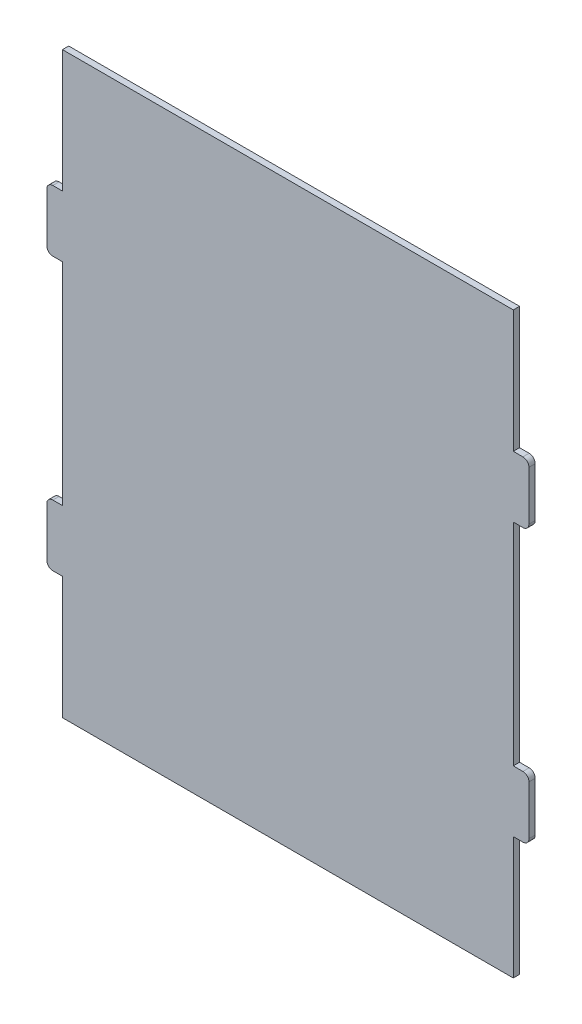
ISO-10303-21;
HEADER;
FILE_DESCRIPTION(('STEP AP214'),'2;1');
FILE_NAME('part.step','',(''),(''),'','','');
FILE_SCHEMA(('AUTOMOTIVE_DESIGN { 1 0 10303 214 1 1 1 1 }'));
ENDSEC;
DATA;
#1=APPLICATION_CONTEXT('core data for automotive mechanical design processes');
#2=APPLICATION_PROTOCOL_DEFINITION('international standard','automotive_design',2000,#1);
#3=PRODUCT_CONTEXT('',#1,'mechanical');
#4=PRODUCT('Part','Part','',(#3));
#5=PRODUCT_RELATED_PRODUCT_CATEGORY('part','',(#4));
#6=PRODUCT_DEFINITION_FORMATION('','',#4);
#7=PRODUCT_DEFINITION_CONTEXT('part definition',#1,'design');
#8=PRODUCT_DEFINITION('design','',#6,#7);
#9=PRODUCT_DEFINITION_SHAPE('','',#8);
#10=(LENGTH_UNIT() NAMED_UNIT(*) SI_UNIT(.MILLI.,.METRE.));
#11=(NAMED_UNIT(*) PLANE_ANGLE_UNIT() SI_UNIT($,.RADIAN.));
#12=(NAMED_UNIT(*) SI_UNIT($,.STERADIAN.) SOLID_ANGLE_UNIT());
#13=UNCERTAINTY_MEASURE_WITH_UNIT(LENGTH_MEASURE(1.E-05),#10,'distance_accuracy_value','');
#14=(GEOMETRIC_REPRESENTATION_CONTEXT(3) GLOBAL_UNCERTAINTY_ASSIGNED_CONTEXT((#13)) GLOBAL_UNIT_ASSIGNED_CONTEXT((#10,
#11,#12)) REPRESENTATION_CONTEXT('',''));
#15=CARTESIAN_POINT('',(0.,0.,0.));
#16=DIRECTION('',(0.,0.,1.));
#17=DIRECTION('',(1.,0.,0.));
#18=AXIS2_PLACEMENT_3D('',#15,#16,#17);
#19=CARTESIAN_POINT('',(-97.5,-46.3,2.6));
#20=DIRECTION('',(0.,0.,-1.));
#21=DIRECTION('',(-1.,0.,0.));
#22=AXIS2_PLACEMENT_3D('',#19,#20,#21);
#23=CYLINDRICAL_SURFACE('',#22,2.5);
#24=CARTESIAN_POINT('',(-97.5,-46.3,0.));
#25=DIRECTION('',(0.,0.,1.));
#26=DIRECTION('',(1.,0.,0.));
#27=AXIS2_PLACEMENT_3D('',#24,#25,#26);
#28=CIRCLE('',#27,2.5);
#29=CARTESIAN_POINT('',(-97.5,-43.8,0.));
#30=VERTEX_POINT('',#29);
#31=CARTESIAN_POINT('',(-100.,-46.3,0.));
#32=VERTEX_POINT('',#31);
#33=EDGE_CURVE('E249',#30,#32,#28,.T.);
#34=ORIENTED_EDGE('',*,*,#33,.T.);
#35=DIRECTION('',(0.,0.,-1.));
#36=VECTOR('',#35,1.);
#37=CARTESIAN_POINT('',(-100.,-46.3,2.6));
#38=LINE('',#37,#36);
#39=CARTESIAN_POINT('',(-100.,-46.3,2.6));
#40=VERTEX_POINT('',#39);
#41=EDGE_CURVE('E11',#40,#32,#38,.T.);
#42=ORIENTED_EDGE('',*,*,#41,.F.);
#43=CARTESIAN_POINT('',(-97.5,-46.3,2.6));
#44=DIRECTION('',(0.,0.,1.));
#45=DIRECTION('',(1.,0.,0.));
#46=AXIS2_PLACEMENT_3D('',#43,#44,#45);
#47=CIRCLE('',#46,2.5);
#48=CARTESIAN_POINT('',(-97.5,-43.8,2.6));
#49=VERTEX_POINT('',#48);
#50=EDGE_CURVE('E303',#49,#40,#47,.T.);
#51=ORIENTED_EDGE('',*,*,#50,.F.);
#52=DIRECTION('',(0.,0.,-1.));
#53=VECTOR('',#52,1.);
#54=CARTESIAN_POINT('',(-97.5,-43.8,2.6));
#55=LINE('',#54,#53);
#56=EDGE_CURVE('E245',#49,#30,#55,.T.);
#57=ORIENTED_EDGE('',*,*,#56,.T.);
#58=EDGE_LOOP('',(#34,#42,#51,#57));
#59=FACE_BOUND('',#58,.T.);
#60=ADVANCED_FACE('F33',(#59),#23,.T.);
#61=CARTESIAN_POINT('',(-100.,-66.7,2.6));
#62=DIRECTION('',(1.,0.,0.));
#63=DIRECTION('',(0.,0.,-1.));
#64=AXIS2_PLACEMENT_3D('',#61,#62,#63);
#65=PLANE('',#64);
#66=DIRECTION('',(0.,-1.,0.));
#67=VECTOR('',#66,1.);
#68=CARTESIAN_POINT('',(-100.,-66.7,0.));
#69=LINE('',#68,#67);
#70=CARTESIAN_POINT('',(-100.,-66.7,0.));
#71=VERTEX_POINT('',#70);
#72=EDGE_CURVE('E252',#32,#71,#69,.T.);
#73=ORIENTED_EDGE('',*,*,#72,.T.);
#74=DIRECTION('',(0.,0.,-1.));
#75=VECTOR('',#74,1.);
#76=CARTESIAN_POINT('',(-100.,-66.7,2.6));
#77=LINE('',#76,#75);
#78=CARTESIAN_POINT('',(-100.,-66.7,2.6));
#79=VERTEX_POINT('',#78);
#80=EDGE_CURVE('E41',#79,#71,#77,.T.);
#81=ORIENTED_EDGE('',*,*,#80,.F.);
#82=DIRECTION('',(0.,-1.,0.));
#83=VECTOR('',#82,1.);
#84=CARTESIAN_POINT('',(-100.,-66.7,2.6));
#85=LINE('',#84,#83);
#86=EDGE_CURVE('E152',#40,#79,#85,.T.);
#87=ORIENTED_EDGE('',*,*,#86,.F.);
#88=ORIENTED_EDGE('',*,*,#41,.T.);
#89=EDGE_LOOP('',(#73,#81,#87,#88));
#90=FACE_BOUND('',#89,.T.);
#91=ADVANCED_FACE('F461',(#90),#65,.F.);
#92=CARTESIAN_POINT('',(-97.5,-66.7,2.6));
#93=DIRECTION('',(0.,0.,-1.));
#94=DIRECTION('',(-1.,0.,0.));
#95=AXIS2_PLACEMENT_3D('',#92,#93,#94);
#96=CYLINDRICAL_SURFACE('',#95,2.50000000000004);
#97=CARTESIAN_POINT('',(-97.5,-66.7,0.));
#98=DIRECTION('',(0.,0.,1.));
#99=DIRECTION('',(1.,0.,0.));
#100=AXIS2_PLACEMENT_3D('',#97,#98,#99);
#101=CIRCLE('',#100,2.50000000000004);
#102=CARTESIAN_POINT('',(-97.5,-69.2,0.));
#103=VERTEX_POINT('',#102);
#104=EDGE_CURVE('E254',#71,#103,#101,.T.);
#105=ORIENTED_EDGE('',*,*,#104,.T.);
#106=DIRECTION('',(0.,0.,-1.));
#107=VECTOR('',#106,1.);
#108=CARTESIAN_POINT('',(-97.5,-69.2,2.6));
#109=LINE('',#108,#107);
#110=CARTESIAN_POINT('',(-97.5,-69.2,2.6));
#111=VERTEX_POINT('',#110);
#112=EDGE_CURVE('E370',#111,#103,#109,.T.);
#113=ORIENTED_EDGE('',*,*,#112,.F.);
#114=CARTESIAN_POINT('',(-97.5,-66.7,2.6));
#115=DIRECTION('',(0.,0.,1.));
#116=DIRECTION('',(1.,0.,0.));
#117=AXIS2_PLACEMENT_3D('',#114,#115,#116);
#118=CIRCLE('',#117,2.50000000000004);
#119=EDGE_CURVE('E378',#79,#111,#118,.T.);
#120=ORIENTED_EDGE('',*,*,#119,.F.);
#121=ORIENTED_EDGE('',*,*,#80,.T.);
#122=EDGE_LOOP('',(#105,#113,#120,#121));
#123=FACE_BOUND('',#122,.T.);
#124=ADVANCED_FACE('F376',(#123),#96,.T.);
#125=CARTESIAN_POINT('',(-93.5,-69.2,2.6));
#126=DIRECTION('',(0.,1.,0.));
#127=DIRECTION('',(0.,0.,1.));
#128=AXIS2_PLACEMENT_3D('',#125,#126,#127);
#129=PLANE('',#128);
#130=DIRECTION('',(1.,0.,0.));
#131=VECTOR('',#130,1.);
#132=CARTESIAN_POINT('',(-93.5,-69.2,0.));
#133=LINE('',#132,#131);
#134=CARTESIAN_POINT('',(-93.5,-69.2,0.));
#135=VERTEX_POINT('',#134);
#136=EDGE_CURVE('E256',#103,#135,#133,.T.);
#137=ORIENTED_EDGE('',*,*,#136,.T.);
#138=DIRECTION('',(0.,0.,-1.));
#139=VECTOR('',#138,1.);
#140=CARTESIAN_POINT('',(-93.5,-69.2,2.6));
#141=LINE('',#140,#139);
#142=CARTESIAN_POINT('',(-93.5,-69.2,2.6));
#143=VERTEX_POINT('',#142);
#144=EDGE_CURVE('E367',#143,#135,#141,.T.);
#145=ORIENTED_EDGE('',*,*,#144,.F.);
#146=DIRECTION('',(1.,0.,0.));
#147=VECTOR('',#146,1.);
#148=CARTESIAN_POINT('',(-93.5,-69.2,2.6));
#149=LINE('',#148,#147);
#150=EDGE_CURVE('E396',#111,#143,#149,.T.);
#151=ORIENTED_EDGE('',*,*,#150,.F.);
#152=ORIENTED_EDGE('',*,*,#112,.T.);
#153=EDGE_LOOP('',(#137,#145,#151,#152));
#154=FACE_BOUND('',#153,.T.);
#155=ADVANCED_FACE('F387',(#154),#129,.F.);
#156=CARTESIAN_POINT('',(-93.5,-69.2,2.6));
#157=DIRECTION('',(1.,0.,0.));
#158=DIRECTION('',(0.,0.,-1.));
#159=AXIS2_PLACEMENT_3D('',#156,#157,#158);
#160=PLANE('',#159);
#161=DIRECTION('',(0.,-1.,0.));
#162=VECTOR('',#161,1.);
#163=CARTESIAN_POINT('',(-93.5,-69.2,0.));
#164=LINE('',#163,#162);
#165=CARTESIAN_POINT('',(-93.5,-120.,0.));
#166=VERTEX_POINT('',#165);
#167=EDGE_CURVE('E258',#135,#166,#164,.T.);
#168=ORIENTED_EDGE('',*,*,#167,.T.);
#169=DIRECTION('',(0.,0.,-1.));
#170=VECTOR('',#169,1.);
#171=CARTESIAN_POINT('',(-93.5,-120.,2.6));
#172=LINE('',#171,#170);
#173=CARTESIAN_POINT('',(-93.5,-120.,2.6));
#174=VERTEX_POINT('',#173);
#175=EDGE_CURVE('E364',#174,#166,#172,.T.);
#176=ORIENTED_EDGE('',*,*,#175,.F.);
#177=DIRECTION('',(0.,-1.,0.));
#178=VECTOR('',#177,1.);
#179=CARTESIAN_POINT('',(-93.5,-69.2,2.6));
#180=LINE('',#179,#178);
#181=EDGE_CURVE('E393',#143,#174,#180,.T.);
#182=ORIENTED_EDGE('',*,*,#181,.F.);
#183=ORIENTED_EDGE('',*,*,#144,.T.);
#184=EDGE_LOOP('',(#168,#176,#182,#183));
#185=FACE_BOUND('',#184,.T.);
#186=ADVANCED_FACE('F391',(#185),#160,.F.);
#187=CARTESIAN_POINT('',(-93.5,-120.,2.6));
#188=DIRECTION('',(0.,1.,0.));
#189=DIRECTION('',(0.,0.,1.));
#190=AXIS2_PLACEMENT_3D('',#187,#188,#189);
#191=PLANE('',#190);
#192=DIRECTION('',(1.,0.,0.));
#193=VECTOR('',#192,1.);
#194=CARTESIAN_POINT('',(-93.5,-120.,0.));
#195=LINE('',#194,#193);
#196=CARTESIAN_POINT('',(93.5,-120.,0.));
#197=VERTEX_POINT('',#196);
#198=EDGE_CURVE('E260',#166,#197,#195,.T.);
#199=ORIENTED_EDGE('',*,*,#198,.T.);
#200=DIRECTION('',(0.,0.,-1.));
#201=VECTOR('',#200,1.);
#202=CARTESIAN_POINT('',(93.5,-120.,2.6));
#203=LINE('',#202,#201);
#204=CARTESIAN_POINT('',(93.5,-120.,2.6));
#205=VERTEX_POINT('',#204);
#206=EDGE_CURVE('E361',#205,#197,#203,.T.);
#207=ORIENTED_EDGE('',*,*,#206,.F.);
#208=DIRECTION('',(1.,0.,0.));
#209=VECTOR('',#208,1.);
#210=CARTESIAN_POINT('',(-93.5,-120.,2.6));
#211=LINE('',#210,#209);
#212=EDGE_CURVE('E395',#174,#205,#211,.T.);
#213=ORIENTED_EDGE('',*,*,#212,.F.);
#214=ORIENTED_EDGE('',*,*,#175,.T.);
#215=EDGE_LOOP('',(#199,#207,#213,#214));
#216=FACE_BOUND('',#215,.T.);
#217=ADVANCED_FACE('F474',(#216),#191,.F.);
#218=CARTESIAN_POINT('',(93.5,-120.,2.6));
#219=DIRECTION('',(-1.,0.,0.));
#220=DIRECTION('',(0.,0.,1.));
#221=AXIS2_PLACEMENT_3D('',#218,#219,#220);
#222=PLANE('',#221);
#223=DIRECTION('',(0.,1.,0.));
#224=VECTOR('',#223,1.);
#225=CARTESIAN_POINT('',(93.5,-120.,0.));
#226=LINE('',#225,#224);
#227=CARTESIAN_POINT('',(93.5,-69.2,0.));
#228=VERTEX_POINT('',#227);
#229=EDGE_CURVE('E262',#197,#228,#226,.T.);
#230=ORIENTED_EDGE('',*,*,#229,.T.);
#231=DIRECTION('',(0.,0.,-1.));
#232=VECTOR('',#231,1.);
#233=CARTESIAN_POINT('',(93.5,-69.2,2.6));
#234=LINE('',#233,#232);
#235=CARTESIAN_POINT('',(93.5,-69.2,2.6));
#236=VERTEX_POINT('',#235);
#237=EDGE_CURVE('E358',#236,#228,#234,.T.);
#238=ORIENTED_EDGE('',*,*,#237,.F.);
#239=DIRECTION('',(0.,1.,0.));
#240=VECTOR('',#239,1.);
#241=CARTESIAN_POINT('',(93.5,-120.,2.6));
#242=LINE('',#241,#240);
#243=EDGE_CURVE('E398',#205,#236,#242,.T.);
#244=ORIENTED_EDGE('',*,*,#243,.F.);
#245=ORIENTED_EDGE('',*,*,#206,.T.);
#246=EDGE_LOOP('',(#230,#238,#244,#245));
#247=FACE_BOUND('',#246,.T.);
#248=ADVANCED_FACE('F477',(#247),#222,.F.);
#249=CARTESIAN_POINT('',(93.5,-69.2,2.6));
#250=DIRECTION('',(0.,1.,0.));
#251=DIRECTION('',(0.,0.,1.));
#252=AXIS2_PLACEMENT_3D('',#249,#250,#251);
#253=PLANE('',#252);
#254=DIRECTION('',(1.,0.,0.));
#255=VECTOR('',#254,1.);
#256=CARTESIAN_POINT('',(93.5,-69.2,0.));
#257=LINE('',#256,#255);
#258=CARTESIAN_POINT('',(97.5,-69.2,0.));
#259=VERTEX_POINT('',#258);
#260=EDGE_CURVE('E264',#228,#259,#257,.T.);
#261=ORIENTED_EDGE('',*,*,#260,.T.);
#262=DIRECTION('',(0.,0.,-1.));
#263=VECTOR('',#262,1.);
#264=CARTESIAN_POINT('',(97.5,-69.2,2.6));
#265=LINE('',#264,#263);
#266=CARTESIAN_POINT('',(97.5,-69.2,2.6));
#267=VERTEX_POINT('',#266);
#268=EDGE_CURVE('E355',#267,#259,#265,.T.);
#269=ORIENTED_EDGE('',*,*,#268,.F.);
#270=DIRECTION('',(1.,0.,0.));
#271=VECTOR('',#270,1.);
#272=CARTESIAN_POINT('',(93.5,-69.2,2.6));
#273=LINE('',#272,#271);
#274=EDGE_CURVE('E404',#236,#267,#273,.T.);
#275=ORIENTED_EDGE('',*,*,#274,.F.);
#276=ORIENTED_EDGE('',*,*,#237,.T.);
#277=EDGE_LOOP('',(#261,#269,#275,#276));
#278=FACE_BOUND('',#277,.T.);
#279=ADVANCED_FACE('F481',(#278),#253,.F.);
#280=CARTESIAN_POINT('',(97.5,-66.7,2.6));
#281=DIRECTION('',(0.,0.,-1.));
#282=DIRECTION('',(-1.,0.,0.));
#283=AXIS2_PLACEMENT_3D('',#280,#281,#282);
#284=CYLINDRICAL_SURFACE('',#283,2.50000000000004);
#285=CARTESIAN_POINT('',(97.5,-66.7,0.));
#286=DIRECTION('',(0.,0.,1.));
#287=DIRECTION('',(1.,0.,0.));
#288=AXIS2_PLACEMENT_3D('',#285,#286,#287);
#289=CIRCLE('',#288,2.50000000000004);
#290=CARTESIAN_POINT('',(100.,-66.7,0.));
#291=VERTEX_POINT('',#290);
#292=EDGE_CURVE('E266',#259,#291,#289,.T.);
#293=ORIENTED_EDGE('',*,*,#292,.T.);
#294=DIRECTION('',(0.,0.,-1.));
#295=VECTOR('',#294,1.);
#296=CARTESIAN_POINT('',(100.,-66.7,2.6));
#297=LINE('',#296,#295);
#298=CARTESIAN_POINT('',(100.,-66.7,2.6));
#299=VERTEX_POINT('',#298);
#300=EDGE_CURVE('E352',#299,#291,#297,.T.);
#301=ORIENTED_EDGE('',*,*,#300,.F.);
#302=CARTESIAN_POINT('',(97.5,-66.7,2.6));
#303=DIRECTION('',(0.,0.,1.));
#304=DIRECTION('',(1.,0.,0.));
#305=AXIS2_PLACEMENT_3D('',#302,#303,#304);
#306=CIRCLE('',#305,2.50000000000004);
#307=EDGE_CURVE('E406',#267,#299,#306,.T.);
#308=ORIENTED_EDGE('',*,*,#307,.F.);
#309=ORIENTED_EDGE('',*,*,#268,.T.);
#310=EDGE_LOOP('',(#293,#301,#308,#309));
#311=FACE_BOUND('',#310,.T.);
#312=ADVANCED_FACE('F485',(#311),#284,.T.);
#313=CARTESIAN_POINT('',(100.,-66.7,2.6));
#314=DIRECTION('',(-1.,0.,0.));
#315=DIRECTION('',(0.,0.,1.));
#316=AXIS2_PLACEMENT_3D('',#313,#314,#315);
#317=PLANE('',#316);
#318=DIRECTION('',(0.,1.,0.));
#319=VECTOR('',#318,1.);
#320=CARTESIAN_POINT('',(100.,-66.7,0.));
#321=LINE('',#320,#319);
#322=CARTESIAN_POINT('',(100.,-46.3,0.));
#323=VERTEX_POINT('',#322);
#324=EDGE_CURVE('E268',#291,#323,#321,.T.);
#325=ORIENTED_EDGE('',*,*,#324,.T.);
#326=DIRECTION('',(0.,0.,-1.));
#327=VECTOR('',#326,1.);
#328=CARTESIAN_POINT('',(100.,-46.3,2.6));
#329=LINE('',#328,#327);
#330=CARTESIAN_POINT('',(100.,-46.3,2.6));
#331=VERTEX_POINT('',#330);
#332=EDGE_CURVE('E349',#331,#323,#329,.T.);
#333=ORIENTED_EDGE('',*,*,#332,.F.);
#334=DIRECTION('',(0.,1.,0.));
#335=VECTOR('',#334,1.);
#336=CARTESIAN_POINT('',(100.,-66.7,2.6));
#337=LINE('',#336,#335);
#338=EDGE_CURVE('E408',#299,#331,#337,.T.);
#339=ORIENTED_EDGE('',*,*,#338,.F.);
#340=ORIENTED_EDGE('',*,*,#300,.T.);
#341=EDGE_LOOP('',(#325,#333,#339,#340));
#342=FACE_BOUND('',#341,.T.);
#343=ADVANCED_FACE('F489',(#342),#317,.F.);
#344=CARTESIAN_POINT('',(97.5,-46.3,2.6));
#345=DIRECTION('',(0.,0.,-1.));
#346=DIRECTION('',(-1.,0.,0.));
#347=AXIS2_PLACEMENT_3D('',#344,#345,#346);
#348=CYLINDRICAL_SURFACE('',#347,2.5);
#349=CARTESIAN_POINT('',(97.5,-46.3,0.));
#350=DIRECTION('',(0.,0.,1.));
#351=DIRECTION('',(1.,0.,0.));
#352=AXIS2_PLACEMENT_3D('',#349,#350,#351);
#353=CIRCLE('',#352,2.5);
#354=CARTESIAN_POINT('',(97.5,-43.8,0.));
#355=VERTEX_POINT('',#354);
#356=EDGE_CURVE('E270',#323,#355,#353,.T.);
#357=ORIENTED_EDGE('',*,*,#356,.T.);
#358=DIRECTION('',(0.,0.,-1.));
#359=VECTOR('',#358,1.);
#360=CARTESIAN_POINT('',(97.5,-43.8,2.6));
#361=LINE('',#360,#359);
#362=CARTESIAN_POINT('',(97.5,-43.8,2.6));
#363=VERTEX_POINT('',#362);
#364=EDGE_CURVE('E346',#363,#355,#361,.T.);
#365=ORIENTED_EDGE('',*,*,#364,.F.);
#366=CARTESIAN_POINT('',(97.5,-46.3,2.6));
#367=DIRECTION('',(0.,0.,1.));
#368=DIRECTION('',(1.,0.,0.));
#369=AXIS2_PLACEMENT_3D('',#366,#367,#368);
#370=CIRCLE('',#369,2.5);
#371=EDGE_CURVE('E410',#331,#363,#370,.T.);
#372=ORIENTED_EDGE('',*,*,#371,.F.);
#373=ORIENTED_EDGE('',*,*,#332,.T.);
#374=EDGE_LOOP('',(#357,#365,#372,#373));
#375=FACE_BOUND('',#374,.T.);
#376=ADVANCED_FACE('F493',(#375),#348,.T.);
#377=CARTESIAN_POINT('',(97.5,-43.8,2.6));
#378=DIRECTION('',(0.,-1.,0.));
#379=DIRECTION('',(0.,0.,-1.));
#380=AXIS2_PLACEMENT_3D('',#377,#378,#379);
#381=PLANE('',#380);
#382=DIRECTION('',(-1.,0.,0.));
#383=VECTOR('',#382,1.);
#384=CARTESIAN_POINT('',(97.5,-43.8,0.));
#385=LINE('',#384,#383);
#386=CARTESIAN_POINT('',(93.5,-43.8,0.));
#387=VERTEX_POINT('',#386);
#388=EDGE_CURVE('E272',#355,#387,#385,.T.);
#389=ORIENTED_EDGE('',*,*,#388,.T.);
#390=DIRECTION('',(0.,0.,-1.));
#391=VECTOR('',#390,1.);
#392=CARTESIAN_POINT('',(93.5,-43.8,2.6));
#393=LINE('',#392,#391);
#394=CARTESIAN_POINT('',(93.5,-43.8,2.6));
#395=VERTEX_POINT('',#394);
#396=EDGE_CURVE('E343',#395,#387,#393,.T.);
#397=ORIENTED_EDGE('',*,*,#396,.F.);
#398=DIRECTION('',(-1.,0.,0.));
#399=VECTOR('',#398,1.);
#400=CARTESIAN_POINT('',(97.5,-43.8,2.6));
#401=LINE('',#400,#399);
#402=EDGE_CURVE('E412',#363,#395,#401,.T.);
#403=ORIENTED_EDGE('',*,*,#402,.F.);
#404=ORIENTED_EDGE('',*,*,#364,.T.);
#405=EDGE_LOOP('',(#389,#397,#403,#404));
#406=FACE_BOUND('',#405,.T.);
#407=ADVANCED_FACE('F497',(#406),#381,.F.);
#408=CARTESIAN_POINT('',(93.5,-43.8,2.6));
#409=DIRECTION('',(-1.,0.,0.));
#410=DIRECTION('',(0.,0.,1.));
#411=AXIS2_PLACEMENT_3D('',#408,#409,#410);
#412=PLANE('',#411);
#413=DIRECTION('',(0.,1.,0.));
#414=VECTOR('',#413,1.);
#415=CARTESIAN_POINT('',(93.5,-43.8,0.));
#416=LINE('',#415,#414);
#417=CARTESIAN_POINT('',(93.5,43.8,0.));
#418=VERTEX_POINT('',#417);
#419=EDGE_CURVE('E274',#387,#418,#416,.T.);
#420=ORIENTED_EDGE('',*,*,#419,.T.);
#421=DIRECTION('',(0.,0.,-1.));
#422=VECTOR('',#421,1.);
#423=CARTESIAN_POINT('',(93.5,43.8,2.6));
#424=LINE('',#423,#422);
#425=CARTESIAN_POINT('',(93.5,43.8,2.6));
#426=VERTEX_POINT('',#425);
#427=EDGE_CURVE('E340',#426,#418,#424,.T.);
#428=ORIENTED_EDGE('',*,*,#427,.F.);
#429=DIRECTION('',(0.,1.,0.));
#430=VECTOR('',#429,1.);
#431=CARTESIAN_POINT('',(93.5,-43.8,2.6));
#432=LINE('',#431,#430);
#433=EDGE_CURVE('E414',#395,#426,#432,.T.);
#434=ORIENTED_EDGE('',*,*,#433,.F.);
#435=ORIENTED_EDGE('',*,*,#396,.T.);
#436=EDGE_LOOP('',(#420,#428,#434,#435));
#437=FACE_BOUND('',#436,.T.);
#438=ADVANCED_FACE('F501',(#437),#412,.F.);
#439=CARTESIAN_POINT('',(93.5,43.8,2.6));
#440=DIRECTION('',(0.,1.,0.));
#441=DIRECTION('',(0.,0.,1.));
#442=AXIS2_PLACEMENT_3D('',#439,#440,#441);
#443=PLANE('',#442);
#444=DIRECTION('',(1.,0.,0.));
#445=VECTOR('',#444,1.);
#446=CARTESIAN_POINT('',(93.5,43.8,0.));
#447=LINE('',#446,#445);
#448=CARTESIAN_POINT('',(97.5,43.8,0.));
#449=VERTEX_POINT('',#448);
#450=EDGE_CURVE('E276',#418,#449,#447,.T.);
#451=ORIENTED_EDGE('',*,*,#450,.T.);
#452=DIRECTION('',(0.,0.,-1.));
#453=VECTOR('',#452,1.);
#454=CARTESIAN_POINT('',(97.5,43.8,2.6));
#455=LINE('',#454,#453);
#456=CARTESIAN_POINT('',(97.5,43.8,2.6));
#457=VERTEX_POINT('',#456);
#458=EDGE_CURVE('E337',#457,#449,#455,.T.);
#459=ORIENTED_EDGE('',*,*,#458,.F.);
#460=DIRECTION('',(1.,0.,0.));
#461=VECTOR('',#460,1.);
#462=CARTESIAN_POINT('',(93.5,43.8,2.6));
#463=LINE('',#462,#461);
#464=EDGE_CURVE('E416',#426,#457,#463,.T.);
#465=ORIENTED_EDGE('',*,*,#464,.F.);
#466=ORIENTED_EDGE('',*,*,#427,.T.);
#467=EDGE_LOOP('',(#451,#459,#465,#466));
#468=FACE_BOUND('',#467,.T.);
#469=ADVANCED_FACE('F505',(#468),#443,.F.);
#470=CARTESIAN_POINT('',(97.5,46.3,2.6));
#471=DIRECTION('',(0.,0.,-1.));
#472=DIRECTION('',(-1.,0.,0.));
#473=AXIS2_PLACEMENT_3D('',#470,#471,#472);
#474=CYLINDRICAL_SURFACE('',#473,2.5);
#475=CARTESIAN_POINT('',(97.5,46.3,0.));
#476=DIRECTION('',(0.,0.,1.));
#477=DIRECTION('',(1.,0.,0.));
#478=AXIS2_PLACEMENT_3D('',#475,#476,#477);
#479=CIRCLE('',#478,2.5);
#480=CARTESIAN_POINT('',(100.,46.3,0.));
#481=VERTEX_POINT('',#480);
#482=EDGE_CURVE('E278',#449,#481,#479,.T.);
#483=ORIENTED_EDGE('',*,*,#482,.T.);
#484=DIRECTION('',(0.,0.,-1.));
#485=VECTOR('',#484,1.);
#486=CARTESIAN_POINT('',(100.,46.3,2.6));
#487=LINE('',#486,#485);
#488=CARTESIAN_POINT('',(100.,46.3,2.6));
#489=VERTEX_POINT('',#488);
#490=EDGE_CURVE('E334',#489,#481,#487,.T.);
#491=ORIENTED_EDGE('',*,*,#490,.F.);
#492=CARTESIAN_POINT('',(97.5,46.3,2.6));
#493=DIRECTION('',(0.,0.,1.));
#494=DIRECTION('',(1.,0.,0.));
#495=AXIS2_PLACEMENT_3D('',#492,#493,#494);
#496=CIRCLE('',#495,2.5);
#497=EDGE_CURVE('E418',#457,#489,#496,.T.);
#498=ORIENTED_EDGE('',*,*,#497,.F.);
#499=ORIENTED_EDGE('',*,*,#458,.T.);
#500=EDGE_LOOP('',(#483,#491,#498,#499));
#501=FACE_BOUND('',#500,.T.);
#502=ADVANCED_FACE('F509',(#501),#474,.T.);
#503=CARTESIAN_POINT('',(100.,46.3,2.6));
#504=DIRECTION('',(-1.,0.,0.));
#505=DIRECTION('',(0.,0.,1.));
#506=AXIS2_PLACEMENT_3D('',#503,#504,#505);
#507=PLANE('',#506);
#508=DIRECTION('',(0.,1.,0.));
#509=VECTOR('',#508,1.);
#510=CARTESIAN_POINT('',(100.,46.3,0.));
#511=LINE('',#510,#509);
#512=CARTESIAN_POINT('',(100.,66.7,0.));
#513=VERTEX_POINT('',#512);
#514=EDGE_CURVE('E280',#481,#513,#511,.T.);
#515=ORIENTED_EDGE('',*,*,#514,.T.);
#516=DIRECTION('',(0.,0.,-1.));
#517=VECTOR('',#516,1.);
#518=CARTESIAN_POINT('',(100.,66.7,2.6));
#519=LINE('',#518,#517);
#520=CARTESIAN_POINT('',(100.,66.7,2.6));
#521=VERTEX_POINT('',#520);
#522=EDGE_CURVE('E331',#521,#513,#519,.T.);
#523=ORIENTED_EDGE('',*,*,#522,.F.);
#524=DIRECTION('',(0.,1.,0.));
#525=VECTOR('',#524,1.);
#526=CARTESIAN_POINT('',(100.,46.3,2.6));
#527=LINE('',#526,#525);
#528=EDGE_CURVE('E420',#489,#521,#527,.T.);
#529=ORIENTED_EDGE('',*,*,#528,.F.);
#530=ORIENTED_EDGE('',*,*,#490,.T.);
#531=EDGE_LOOP('',(#515,#523,#529,#530));
#532=FACE_BOUND('',#531,.T.);
#533=ADVANCED_FACE('F513',(#532),#507,.F.);
#534=CARTESIAN_POINT('',(97.5,66.7,2.6));
#535=DIRECTION('',(0.,0.,-1.));
#536=DIRECTION('',(-1.,0.,0.));
#537=AXIS2_PLACEMENT_3D('',#534,#535,#536);
#538=CYLINDRICAL_SURFACE('',#537,2.5);
#539=CARTESIAN_POINT('',(97.5,66.7,0.));
#540=DIRECTION('',(0.,0.,1.));
#541=DIRECTION('',(1.,0.,0.));
#542=AXIS2_PLACEMENT_3D('',#539,#540,#541);
#543=CIRCLE('',#542,2.5);
#544=CARTESIAN_POINT('',(97.5,69.2,0.));
#545=VERTEX_POINT('',#544);
#546=EDGE_CURVE('E282',#513,#545,#543,.T.);
#547=ORIENTED_EDGE('',*,*,#546,.T.);
#548=DIRECTION('',(0.,0.,-1.));
#549=VECTOR('',#548,1.);
#550=CARTESIAN_POINT('',(97.5,69.2,2.6));
#551=LINE('',#550,#549);
#552=CARTESIAN_POINT('',(97.5,69.2,2.6));
#553=VERTEX_POINT('',#552);
#554=EDGE_CURVE('E328',#553,#545,#551,.T.);
#555=ORIENTED_EDGE('',*,*,#554,.F.);
#556=CARTESIAN_POINT('',(97.5,66.7,2.6));
#557=DIRECTION('',(0.,0.,1.));
#558=DIRECTION('',(1.,0.,0.));
#559=AXIS2_PLACEMENT_3D('',#556,#557,#558);
#560=CIRCLE('',#559,2.5);
#561=EDGE_CURVE('E422',#521,#553,#560,.T.);
#562=ORIENTED_EDGE('',*,*,#561,.F.);
#563=ORIENTED_EDGE('',*,*,#522,.T.);
#564=EDGE_LOOP('',(#547,#555,#562,#563));
#565=FACE_BOUND('',#564,.T.);
#566=ADVANCED_FACE('F517',(#565),#538,.T.);
#567=CARTESIAN_POINT('',(97.5,69.2,2.6));
#568=DIRECTION('',(0.,-1.,0.));
#569=DIRECTION('',(0.,0.,-1.));
#570=AXIS2_PLACEMENT_3D('',#567,#568,#569);
#571=PLANE('',#570);
#572=DIRECTION('',(-1.,0.,0.));
#573=VECTOR('',#572,1.);
#574=CARTESIAN_POINT('',(97.5,69.2,0.));
#575=LINE('',#574,#573);
#576=CARTESIAN_POINT('',(93.5,69.2,0.));
#577=VERTEX_POINT('',#576);
#578=EDGE_CURVE('E284',#545,#577,#575,.T.);
#579=ORIENTED_EDGE('',*,*,#578,.T.);
#580=DIRECTION('',(0.,0.,-1.));
#581=VECTOR('',#580,1.);
#582=CARTESIAN_POINT('',(93.5,69.2,2.6));
#583=LINE('',#582,#581);
#584=CARTESIAN_POINT('',(93.5,69.2,2.6));
#585=VERTEX_POINT('',#584);
#586=EDGE_CURVE('E325',#585,#577,#583,.T.);
#587=ORIENTED_EDGE('',*,*,#586,.F.);
#588=DIRECTION('',(-1.,0.,0.));
#589=VECTOR('',#588,1.);
#590=CARTESIAN_POINT('',(97.5,69.2,2.6));
#591=LINE('',#590,#589);
#592=EDGE_CURVE('E424',#553,#585,#591,.T.);
#593=ORIENTED_EDGE('',*,*,#592,.F.);
#594=ORIENTED_EDGE('',*,*,#554,.T.);
#595=EDGE_LOOP('',(#579,#587,#593,#594));
#596=FACE_BOUND('',#595,.T.);
#597=ADVANCED_FACE('F521',(#596),#571,.F.);
#598=CARTESIAN_POINT('',(93.5,69.2,2.6));
#599=DIRECTION('',(-1.,0.,0.));
#600=DIRECTION('',(0.,0.,1.));
#601=AXIS2_PLACEMENT_3D('',#598,#599,#600);
#602=PLANE('',#601);
#603=DIRECTION('',(0.,1.,0.));
#604=VECTOR('',#603,1.);
#605=CARTESIAN_POINT('',(93.5,69.2,0.));
#606=LINE('',#605,#604);
#607=CARTESIAN_POINT('',(93.5,120.,0.));
#608=VERTEX_POINT('',#607);
#609=EDGE_CURVE('E286',#577,#608,#606,.T.);
#610=ORIENTED_EDGE('',*,*,#609,.T.);
#611=DIRECTION('',(0.,0.,-1.));
#612=VECTOR('',#611,1.);
#613=CARTESIAN_POINT('',(93.5,120.,2.6));
#614=LINE('',#613,#612);
#615=CARTESIAN_POINT('',(93.5,120.,2.6));
#616=VERTEX_POINT('',#615);
#617=EDGE_CURVE('E322',#616,#608,#614,.T.);
#618=ORIENTED_EDGE('',*,*,#617,.F.);
#619=DIRECTION('',(0.,1.,0.));
#620=VECTOR('',#619,1.);
#621=CARTESIAN_POINT('',(93.5,69.2,2.6));
#622=LINE('',#621,#620);
#623=EDGE_CURVE('E426',#585,#616,#622,.T.);
#624=ORIENTED_EDGE('',*,*,#623,.F.);
#625=ORIENTED_EDGE('',*,*,#586,.T.);
#626=EDGE_LOOP('',(#610,#618,#624,#625));
#627=FACE_BOUND('',#626,.T.);
#628=ADVANCED_FACE('F525',(#627),#602,.F.);
#629=CARTESIAN_POINT('',(93.5,120.,2.6));
#630=DIRECTION('',(0.,-1.,0.));
#631=DIRECTION('',(0.,0.,-1.));
#632=AXIS2_PLACEMENT_3D('',#629,#630,#631);
#633=PLANE('',#632);
#634=DIRECTION('',(-1.,0.,0.));
#635=VECTOR('',#634,1.);
#636=CARTESIAN_POINT('',(93.5,120.,0.));
#637=LINE('',#636,#635);
#638=CARTESIAN_POINT('',(-93.5,120.,0.));
#639=VERTEX_POINT('',#638);
#640=EDGE_CURVE('E288',#608,#639,#637,.T.);
#641=ORIENTED_EDGE('',*,*,#640,.T.);
#642=DIRECTION('',(0.,0.,-1.));
#643=VECTOR('',#642,1.);
#644=CARTESIAN_POINT('',(-93.5,120.,2.6));
#645=LINE('',#644,#643);
#646=CARTESIAN_POINT('',(-93.5,120.,2.6));
#647=VERTEX_POINT('',#646);
#648=EDGE_CURVE('E319',#647,#639,#645,.T.);
#649=ORIENTED_EDGE('',*,*,#648,.F.);
#650=DIRECTION('',(-1.,0.,0.));
#651=VECTOR('',#650,1.);
#652=CARTESIAN_POINT('',(93.5,120.,2.6));
#653=LINE('',#652,#651);
#654=EDGE_CURVE('E428',#616,#647,#653,.T.);
#655=ORIENTED_EDGE('',*,*,#654,.F.);
#656=ORIENTED_EDGE('',*,*,#617,.T.);
#657=EDGE_LOOP('',(#641,#649,#655,#656));
#658=FACE_BOUND('',#657,.T.);
#659=ADVANCED_FACE('F529',(#658),#633,.F.);
#660=CARTESIAN_POINT('',(-93.5,120.,2.6));
#661=DIRECTION('',(1.,0.,0.));
#662=DIRECTION('',(0.,0.,-1.));
#663=AXIS2_PLACEMENT_3D('',#660,#661,#662);
#664=PLANE('',#663);
#665=DIRECTION('',(0.,-1.,0.));
#666=VECTOR('',#665,1.);
#667=CARTESIAN_POINT('',(-93.5,120.,0.));
#668=LINE('',#667,#666);
#669=CARTESIAN_POINT('',(-93.5,69.2,0.));
#670=VERTEX_POINT('',#669);
#671=EDGE_CURVE('E290',#639,#670,#668,.T.);
#672=ORIENTED_EDGE('',*,*,#671,.T.);
#673=DIRECTION('',(0.,0.,-1.));
#674=VECTOR('',#673,1.);
#675=CARTESIAN_POINT('',(-93.5,69.2,2.6));
#676=LINE('',#675,#674);
#677=CARTESIAN_POINT('',(-93.5,69.2,2.6));
#678=VERTEX_POINT('',#677);
#679=EDGE_CURVE('E316',#678,#670,#676,.T.);
#680=ORIENTED_EDGE('',*,*,#679,.F.);
#681=DIRECTION('',(0.,-1.,0.));
#682=VECTOR('',#681,1.);
#683=CARTESIAN_POINT('',(-93.5,120.,2.6));
#684=LINE('',#683,#682);
#685=EDGE_CURVE('E430',#647,#678,#684,.T.);
#686=ORIENTED_EDGE('',*,*,#685,.F.);
#687=ORIENTED_EDGE('',*,*,#648,.T.);
#688=EDGE_LOOP('',(#672,#680,#686,#687));
#689=FACE_BOUND('',#688,.T.);
#690=ADVANCED_FACE('F533',(#689),#664,.F.);
#691=CARTESIAN_POINT('',(-97.5,69.2,2.6));
#692=DIRECTION('',(0.,-1.,0.));
#693=DIRECTION('',(0.,0.,-1.));
#694=AXIS2_PLACEMENT_3D('',#691,#692,#693);
#695=PLANE('',#694);
#696=DIRECTION('',(-1.,0.,0.));
#697=VECTOR('',#696,1.);
#698=CARTESIAN_POINT('',(-97.5,69.2,0.));
#699=LINE('',#698,#697);
#700=CARTESIAN_POINT('',(-97.5,69.2,0.));
#701=VERTEX_POINT('',#700);
#702=EDGE_CURVE('E292',#670,#701,#699,.T.);
#703=ORIENTED_EDGE('',*,*,#702,.T.);
#704=DIRECTION('',(0.,0.,-1.));
#705=VECTOR('',#704,1.);
#706=CARTESIAN_POINT('',(-97.5,69.2,2.6));
#707=LINE('',#706,#705);
#708=CARTESIAN_POINT('',(-97.5,69.2,2.6));
#709=VERTEX_POINT('',#708);
#710=EDGE_CURVE('E313',#709,#701,#707,.T.);
#711=ORIENTED_EDGE('',*,*,#710,.F.);
#712=DIRECTION('',(-1.,0.,0.));
#713=VECTOR('',#712,1.);
#714=CARTESIAN_POINT('',(-97.5,69.2,2.6));
#715=LINE('',#714,#713);
#716=EDGE_CURVE('E432',#678,#709,#715,.T.);
#717=ORIENTED_EDGE('',*,*,#716,.F.);
#718=ORIENTED_EDGE('',*,*,#679,.T.);
#719=EDGE_LOOP('',(#703,#711,#717,#718));
#720=FACE_BOUND('',#719,.T.);
#721=ADVANCED_FACE('F537',(#720),#695,.F.);
#722=CARTESIAN_POINT('',(-97.5,66.7,2.6));
#723=DIRECTION('',(0.,0.,-1.));
#724=DIRECTION('',(-1.,0.,0.));
#725=AXIS2_PLACEMENT_3D('',#722,#723,#724);
#726=CYLINDRICAL_SURFACE('',#725,2.5);
#727=CARTESIAN_POINT('',(-97.5,66.7,0.));
#728=DIRECTION('',(0.,0.,1.));
#729=DIRECTION('',(1.,0.,0.));
#730=AXIS2_PLACEMENT_3D('',#727,#728,#729);
#731=CIRCLE('',#730,2.5);
#732=CARTESIAN_POINT('',(-100.,66.7,0.));
#733=VERTEX_POINT('',#732);
#734=EDGE_CURVE('E294',#701,#733,#731,.T.);
#735=ORIENTED_EDGE('',*,*,#734,.T.);
#736=DIRECTION('',(0.,0.,-1.));
#737=VECTOR('',#736,1.);
#738=CARTESIAN_POINT('',(-100.,66.7,2.6));
#739=LINE('',#738,#737);
#740=CARTESIAN_POINT('',(-100.,66.7,2.6));
#741=VERTEX_POINT('',#740);
#742=EDGE_CURVE('E310',#741,#733,#739,.T.);
#743=ORIENTED_EDGE('',*,*,#742,.F.);
#744=CARTESIAN_POINT('',(-97.5,66.7,2.6));
#745=DIRECTION('',(0.,0.,1.));
#746=DIRECTION('',(1.,0.,0.));
#747=AXIS2_PLACEMENT_3D('',#744,#745,#746);
#748=CIRCLE('',#747,2.5);
#749=EDGE_CURVE('E434',#709,#741,#748,.T.);
#750=ORIENTED_EDGE('',*,*,#749,.F.);
#751=ORIENTED_EDGE('',*,*,#710,.T.);
#752=EDGE_LOOP('',(#735,#743,#750,#751));
#753=FACE_BOUND('',#752,.T.);
#754=ADVANCED_FACE('F541',(#753),#726,.T.);
#755=CARTESIAN_POINT('',(-100.,46.3,2.6));
#756=DIRECTION('',(1.,0.,0.));
#757=DIRECTION('',(0.,0.,-1.));
#758=AXIS2_PLACEMENT_3D('',#755,#756,#757);
#759=PLANE('',#758);
#760=DIRECTION('',(0.,-1.,0.));
#761=VECTOR('',#760,1.);
#762=CARTESIAN_POINT('',(-100.,46.3,0.));
#763=LINE('',#762,#761);
#764=CARTESIAN_POINT('',(-100.,46.3,0.));
#765=VERTEX_POINT('',#764);
#766=EDGE_CURVE('E296',#733,#765,#763,.T.);
#767=ORIENTED_EDGE('',*,*,#766,.T.);
#768=DIRECTION('',(0.,0.,-1.));
#769=VECTOR('',#768,1.);
#770=CARTESIAN_POINT('',(-100.,46.3,2.6));
#771=LINE('',#770,#769);
#772=CARTESIAN_POINT('',(-100.,46.3,2.6));
#773=VERTEX_POINT('',#772);
#774=EDGE_CURVE('E307',#773,#765,#771,.T.);
#775=ORIENTED_EDGE('',*,*,#774,.F.);
#776=DIRECTION('',(0.,-1.,0.));
#777=VECTOR('',#776,1.);
#778=CARTESIAN_POINT('',(-100.,46.3,2.6));
#779=LINE('',#778,#777);
#780=EDGE_CURVE('E436',#741,#773,#779,.T.);
#781=ORIENTED_EDGE('',*,*,#780,.F.);
#782=ORIENTED_EDGE('',*,*,#742,.T.);
#783=EDGE_LOOP('',(#767,#775,#781,#782));
#784=FACE_BOUND('',#783,.T.);
#785=ADVANCED_FACE('F442',(#784),#759,.F.);
#786=CARTESIAN_POINT('',(-97.5,46.3,2.6));
#787=DIRECTION('',(0.,0.,-1.));
#788=DIRECTION('',(-1.,0.,0.));
#789=AXIS2_PLACEMENT_3D('',#786,#787,#788);
#790=CYLINDRICAL_SURFACE('',#789,2.49999999999999);
#791=CARTESIAN_POINT('',(-97.5,46.3,0.));
#792=DIRECTION('',(0.,0.,1.));
#793=DIRECTION('',(1.,0.,0.));
#794=AXIS2_PLACEMENT_3D('',#791,#792,#793);
#795=CIRCLE('',#794,2.49999999999999);
#796=CARTESIAN_POINT('',(-97.5,43.8,0.));
#797=VERTEX_POINT('',#796);
#798=EDGE_CURVE('E298',#765,#797,#795,.T.);
#799=ORIENTED_EDGE('',*,*,#798,.T.);
#800=DIRECTION('',(0.,0.,-1.));
#801=VECTOR('',#800,1.);
#802=CARTESIAN_POINT('',(-97.5,43.8,2.6));
#803=LINE('',#802,#801);
#804=CARTESIAN_POINT('',(-97.5,43.8,2.6));
#805=VERTEX_POINT('',#804);
#806=EDGE_CURVE('E240',#805,#797,#803,.T.);
#807=ORIENTED_EDGE('',*,*,#806,.F.);
#808=CARTESIAN_POINT('',(-97.5,46.3,2.6));
#809=DIRECTION('',(0.,0.,1.));
#810=DIRECTION('',(1.,0.,0.));
#811=AXIS2_PLACEMENT_3D('',#808,#809,#810);
#812=CIRCLE('',#811,2.49999999999999);
#813=EDGE_CURVE('E231',#773,#805,#812,.T.);
#814=ORIENTED_EDGE('',*,*,#813,.F.);
#815=ORIENTED_EDGE('',*,*,#774,.T.);
#816=EDGE_LOOP('',(#799,#807,#814,#815));
#817=FACE_BOUND('',#816,.T.);
#818=ADVANCED_FACE('F446',(#817),#790,.T.);
#819=CARTESIAN_POINT('',(-93.5,43.8,2.6));
#820=DIRECTION('',(0.,1.,0.));
#821=DIRECTION('',(0.,0.,1.));
#822=AXIS2_PLACEMENT_3D('',#819,#820,#821);
#823=PLANE('',#822);
#824=DIRECTION('',(1.,0.,0.));
#825=VECTOR('',#824,1.);
#826=CARTESIAN_POINT('',(-93.5,43.8,0.));
#827=LINE('',#826,#825);
#828=CARTESIAN_POINT('',(-93.5,43.8,0.));
#829=VERTEX_POINT('',#828);
#830=EDGE_CURVE('E239',#797,#829,#827,.T.);
#831=ORIENTED_EDGE('',*,*,#830,.T.);
#832=DIRECTION('',(0.,0.,-1.));
#833=VECTOR('',#832,1.);
#834=CARTESIAN_POINT('',(-93.5,43.8,2.6));
#835=LINE('',#834,#833);
#836=CARTESIAN_POINT('',(-93.5,43.8,2.6));
#837=VERTEX_POINT('',#836);
#838=EDGE_CURVE('E236',#837,#829,#835,.T.);
#839=ORIENTED_EDGE('',*,*,#838,.F.);
#840=DIRECTION('',(1.,0.,0.));
#841=VECTOR('',#840,1.);
#842=CARTESIAN_POINT('',(-93.5,43.8,2.6));
#843=LINE('',#842,#841);
#844=EDGE_CURVE('E225',#805,#837,#843,.T.);
#845=ORIENTED_EDGE('',*,*,#844,.F.);
#846=ORIENTED_EDGE('',*,*,#806,.T.);
#847=EDGE_LOOP('',(#831,#839,#845,#846));
#848=FACE_BOUND('',#847,.T.);
#849=ADVANCED_FACE('F237',(#848),#823,.F.);
#850=CARTESIAN_POINT('',(-93.5,43.8,2.6));
#851=DIRECTION('',(1.,0.,0.));
#852=DIRECTION('',(0.,0.,-1.));
#853=AXIS2_PLACEMENT_3D('',#850,#851,#852);
#854=PLANE('',#853);
#855=DIRECTION('',(0.,-1.,0.));
#856=VECTOR('',#855,1.);
#857=CARTESIAN_POINT('',(-93.5,43.8,0.));
#858=LINE('',#857,#856);
#859=CARTESIAN_POINT('',(-93.5,-43.8,0.));
#860=VERTEX_POINT('',#859);
#861=EDGE_CURVE('E138',#829,#860,#858,.T.);
#862=ORIENTED_EDGE('',*,*,#861,.T.);
#863=DIRECTION('',(0.,0.,-1.));
#864=VECTOR('',#863,1.);
#865=CARTESIAN_POINT('',(-93.5,-43.8,2.6));
#866=LINE('',#865,#864);
#867=CARTESIAN_POINT('',(-93.5,-43.8,2.6));
#868=VERTEX_POINT('',#867);
#869=EDGE_CURVE('E241',#868,#860,#866,.T.);
#870=ORIENTED_EDGE('',*,*,#869,.F.);
#871=DIRECTION('',(0.,-1.,0.));
#872=VECTOR('',#871,1.);
#873=CARTESIAN_POINT('',(-93.5,43.8,2.6));
#874=LINE('',#873,#872);
#875=EDGE_CURVE('E229',#837,#868,#874,.T.);
#876=ORIENTED_EDGE('',*,*,#875,.F.);
#877=ORIENTED_EDGE('',*,*,#838,.T.);
#878=EDGE_LOOP('',(#862,#870,#876,#877));
#879=FACE_BOUND('',#878,.T.);
#880=ADVANCED_FACE('F243',(#879),#854,.F.);
#881=CARTESIAN_POINT('',(-97.5,-43.8,2.6));
#882=DIRECTION('',(0.,-1.,0.));
#883=DIRECTION('',(0.,0.,-1.));
#884=AXIS2_PLACEMENT_3D('',#881,#882,#883);
#885=PLANE('',#884);
#886=DIRECTION('',(-1.,0.,0.));
#887=VECTOR('',#886,1.);
#888=CARTESIAN_POINT('',(-97.5,-43.8,0.));
#889=LINE('',#888,#887);
#890=EDGE_CURVE('E144',#860,#30,#889,.T.);
#891=ORIENTED_EDGE('',*,*,#890,.T.);
#892=ORIENTED_EDGE('',*,*,#56,.F.);
#893=DIRECTION('',(-1.,0.,0.));
#894=VECTOR('',#893,1.);
#895=CARTESIAN_POINT('',(-97.5,-43.8,2.6));
#896=LINE('',#895,#894);
#897=EDGE_CURVE('E49',#868,#49,#896,.T.);
#898=ORIENTED_EDGE('',*,*,#897,.F.);
#899=ORIENTED_EDGE('',*,*,#869,.T.);
#900=EDGE_LOOP('',(#891,#892,#898,#899));
#901=FACE_BOUND('',#900,.T.);
#902=ADVANCED_FACE('F450',(#901),#885,.F.);
#903=CARTESIAN_POINT('',(-97.5,-46.3,2.6));
#904=DIRECTION('',(0.,0.,1.));
#905=DIRECTION('',(1.,0.,0.));
#906=AXIS2_PLACEMENT_3D('',#903,#904,#905);
#907=PLANE('',#906);
#908=ORIENTED_EDGE('',*,*,#50,.T.);
#909=ORIENTED_EDGE('',*,*,#86,.T.);
#910=ORIENTED_EDGE('',*,*,#119,.T.);
#911=ORIENTED_EDGE('',*,*,#150,.T.);
#912=ORIENTED_EDGE('',*,*,#181,.T.);
#913=ORIENTED_EDGE('',*,*,#212,.T.);
#914=ORIENTED_EDGE('',*,*,#243,.T.);
#915=ORIENTED_EDGE('',*,*,#274,.T.);
#916=ORIENTED_EDGE('',*,*,#307,.T.);
#917=ORIENTED_EDGE('',*,*,#338,.T.);
#918=ORIENTED_EDGE('',*,*,#371,.T.);
#919=ORIENTED_EDGE('',*,*,#402,.T.);
#920=ORIENTED_EDGE('',*,*,#433,.T.);
#921=ORIENTED_EDGE('',*,*,#464,.T.);
#922=ORIENTED_EDGE('',*,*,#497,.T.);
#923=ORIENTED_EDGE('',*,*,#528,.T.);
#924=ORIENTED_EDGE('',*,*,#561,.T.);
#925=ORIENTED_EDGE('',*,*,#592,.T.);
#926=ORIENTED_EDGE('',*,*,#623,.T.);
#927=ORIENTED_EDGE('',*,*,#654,.T.);
#928=ORIENTED_EDGE('',*,*,#685,.T.);
#929=ORIENTED_EDGE('',*,*,#716,.T.);
#930=ORIENTED_EDGE('',*,*,#749,.T.);
#931=ORIENTED_EDGE('',*,*,#780,.T.);
#932=ORIENTED_EDGE('',*,*,#813,.T.);
#933=ORIENTED_EDGE('',*,*,#844,.T.);
#934=ORIENTED_EDGE('',*,*,#875,.T.);
#935=ORIENTED_EDGE('',*,*,#897,.T.);
#936=EDGE_LOOP('',(#908,#909,#910,#911,#912,#913,#914,#915,#916,#917,#918,#919,#920,#921,#922,
#923,#924,#925,#926,#927,#928,#929,#930,#931,#932,#933,#934,#935));
#937=FACE_BOUND('',#936,.T.);
#938=ADVANCED_FACE('F227',(#937),#907,.T.);
#939=CARTESIAN_POINT('',(-97.5,-46.3,0.));
#940=DIRECTION('',(0.,0.,1.));
#941=DIRECTION('',(1.,0.,0.));
#942=AXIS2_PLACEMENT_3D('',#939,#940,#941);
#943=PLANE('',#942);
#944=ORIENTED_EDGE('',*,*,#33,.F.);
#945=ORIENTED_EDGE('',*,*,#890,.F.);
#946=ORIENTED_EDGE('',*,*,#861,.F.);
#947=ORIENTED_EDGE('',*,*,#830,.F.);
#948=ORIENTED_EDGE('',*,*,#798,.F.);
#949=ORIENTED_EDGE('',*,*,#766,.F.);
#950=ORIENTED_EDGE('',*,*,#734,.F.);
#951=ORIENTED_EDGE('',*,*,#702,.F.);
#952=ORIENTED_EDGE('',*,*,#671,.F.);
#953=ORIENTED_EDGE('',*,*,#640,.F.);
#954=ORIENTED_EDGE('',*,*,#609,.F.);
#955=ORIENTED_EDGE('',*,*,#578,.F.);
#956=ORIENTED_EDGE('',*,*,#546,.F.);
#957=ORIENTED_EDGE('',*,*,#514,.F.);
#958=ORIENTED_EDGE('',*,*,#482,.F.);
#959=ORIENTED_EDGE('',*,*,#450,.F.);
#960=ORIENTED_EDGE('',*,*,#419,.F.);
#961=ORIENTED_EDGE('',*,*,#388,.F.);
#962=ORIENTED_EDGE('',*,*,#356,.F.);
#963=ORIENTED_EDGE('',*,*,#324,.F.);
#964=ORIENTED_EDGE('',*,*,#292,.F.);
#965=ORIENTED_EDGE('',*,*,#260,.F.);
#966=ORIENTED_EDGE('',*,*,#229,.F.);
#967=ORIENTED_EDGE('',*,*,#198,.F.);
#968=ORIENTED_EDGE('',*,*,#167,.F.);
#969=ORIENTED_EDGE('',*,*,#136,.F.);
#970=ORIENTED_EDGE('',*,*,#104,.F.);
#971=ORIENTED_EDGE('',*,*,#72,.F.);
#972=EDGE_LOOP('',(#944,#945,#946,#947,#948,#949,#950,#951,#952,#953,#954,#955,#956,#957,#958,
#959,#960,#961,#962,#963,#964,#965,#966,#967,#968,#969,#970,#971));
#973=FACE_BOUND('',#972,.T.);
#974=ADVANCED_FACE('F382',(#973),#943,.F.);
#975=CLOSED_SHELL('',(#60,#91,#124,#155,#186,#217,#248,#279,#312,#343,#376,#407,#438,#469,#502,
#533,#566,#597,#628,#659,#690,#721,#754,#785,#818,#849,#880,#902,#938,#974));
#976=MANIFOLD_SOLID_BREP('B2',#975);
#977=ADVANCED_BREP_SHAPE_REPRESENTATION('',(#18,#976),#14);
#978=SHAPE_DEFINITION_REPRESENTATION(#9,#977);
ENDSEC;
END-ISO-10303-21;
